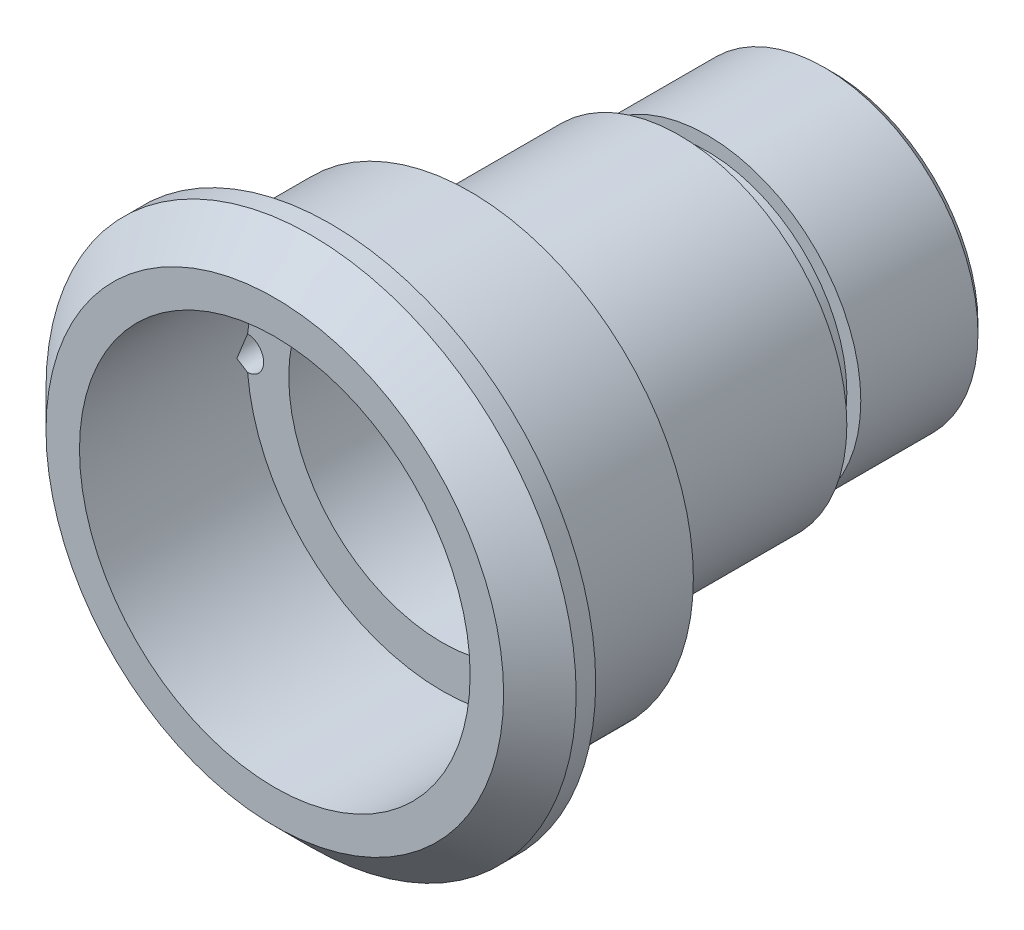
ISO-10303-21;
HEADER;
FILE_DESCRIPTION(('STEP AP214'),'2;1');
FILE_NAME('part.step','',(''),(''),'','','');
FILE_SCHEMA(('AUTOMOTIVE_DESIGN { 1 0 10303 214 1 1 1 1 }'));
ENDSEC;
DATA;
#1=APPLICATION_CONTEXT('core data for automotive mechanical design processes');
#2=APPLICATION_PROTOCOL_DEFINITION('international standard','automotive_design',2000,#1);
#3=PRODUCT_CONTEXT('',#1,'mechanical');
#4=PRODUCT('Part','Part','',(#3));
#5=PRODUCT_RELATED_PRODUCT_CATEGORY('part','',(#4));
#6=PRODUCT_DEFINITION_FORMATION('','',#4);
#7=PRODUCT_DEFINITION_CONTEXT('part definition',#1,'design');
#8=PRODUCT_DEFINITION('design','',#6,#7);
#9=PRODUCT_DEFINITION_SHAPE('','',#8);
#10=(LENGTH_UNIT() NAMED_UNIT(*) SI_UNIT(.MILLI.,.METRE.));
#11=(NAMED_UNIT(*) PLANE_ANGLE_UNIT() SI_UNIT($,.RADIAN.));
#12=(NAMED_UNIT(*) SI_UNIT($,.STERADIAN.) SOLID_ANGLE_UNIT());
#13=UNCERTAINTY_MEASURE_WITH_UNIT(LENGTH_MEASURE(1.E-05),#10,'distance_accuracy_value','');
#14=(GEOMETRIC_REPRESENTATION_CONTEXT(3) GLOBAL_UNCERTAINTY_ASSIGNED_CONTEXT((#13)) GLOBAL_UNIT_ASSIGNED_CONTEXT((#10,
#11,#12)) REPRESENTATION_CONTEXT('',''));
#15=CARTESIAN_POINT('',(0.,0.,0.));
#16=DIRECTION('',(0.,0.,1.));
#17=DIRECTION('',(1.,0.,0.));
#18=AXIS2_PLACEMENT_3D('',#15,#16,#17);
#19=CARTESIAN_POINT('',(0.,0.,-7.));
#20=DIRECTION('',(0.,0.,1.));
#21=DIRECTION('',(1.,0.,0.));
#22=AXIS2_PLACEMENT_3D('',#19,#20,#21);
#23=PLANE('',#22);
#24=CARTESIAN_POINT('',(0.,0.,-7.));
#25=DIRECTION('',(0.,0.,1.));
#26=DIRECTION('',(1.,0.,0.));
#27=AXIS2_PLACEMENT_3D('',#24,#25,#26);
#28=CIRCLE('',#27,8.);
#29=CARTESIAN_POINT('',(8.,0.,-7.));
#30=VERTEX_POINT('',#29);
#31=EDGE_CURVE('E157',#30,#30,#28,.F.);
#32=ORIENTED_EDGE('',*,*,#31,.T.);
#33=EDGE_LOOP('',(#32));
#34=FACE_BOUND('',#33,.T.);
#35=CARTESIAN_POINT('',(7.,0.,-7.));
#36=DIRECTION('',(0.,0.,-1.));
#37=DIRECTION('',(-1.,0.,0.));
#38=AXIS2_PLACEMENT_3D('',#35,#36,#37);
#39=CIRCLE('',#38,0.599999999999989);
#40=CARTESIAN_POINT('',(6.43026088733618,0.188141817523474,-7.));
#41=VERTEX_POINT('',#40);
#42=CARTESIAN_POINT('',(6.43026088733618,-0.188141817523458,-7.));
#43=VERTEX_POINT('',#42);
#44=EDGE_CURVE('E62',#41,#43,#39,.T.);
#45=ORIENTED_EDGE('',*,*,#44,.F.);
#46=CARTESIAN_POINT('',(0.,0.,-7.));
#47=DIRECTION('',(0.,0.,1.));
#48=DIRECTION('',(1.,0.,0.));
#49=AXIS2_PLACEMENT_3D('',#46,#47,#48);
#50=CIRCLE('',#49,6.43301270189221);
#51=CARTESIAN_POINT('',(-6.43026088733618,0.188141817523458,-7.));
#52=VERTEX_POINT('',#51);
#53=EDGE_CURVE('E139',#41,#52,#50,.T.);
#54=ORIENTED_EDGE('',*,*,#53,.T.);
#55=CARTESIAN_POINT('',(-7.,0.,-7.));
#56=DIRECTION('',(0.,0.,-1.));
#57=DIRECTION('',(-1.,0.,0.));
#58=AXIS2_PLACEMENT_3D('',#55,#56,#57);
#59=CIRCLE('',#58,0.599999999999989);
#60=CARTESIAN_POINT('',(-6.43026088733618,-0.188141817523473,-7.));
#61=VERTEX_POINT('',#60);
#62=EDGE_CURVE('E103',#61,#52,#59,.T.);
#63=ORIENTED_EDGE('',*,*,#62,.F.);
#64=EDGE_CURVE('E140',#61,#43,#50,.T.);
#65=ORIENTED_EDGE('',*,*,#64,.T.);
#66=EDGE_LOOP('',(#45,#54,#63,#65));
#67=FACE_BOUND('',#66,.T.);
#68=ADVANCED_FACE('F43',(#34,#67),#23,.F.);
#69=CARTESIAN_POINT('',(0.,0.,-20.));
#70=DIRECTION('',(0.,0.,1.));
#71=DIRECTION('',(1.,0.,0.));
#72=AXIS2_PLACEMENT_3D('',#69,#70,#71);
#73=CYLINDRICAL_SURFACE('',#72,4.05);
#74=CARTESIAN_POINT('',(0.,0.,-14.7));
#75=DIRECTION('',(0.,0.,1.));
#76=DIRECTION('',(1.,0.,0.));
#77=AXIS2_PLACEMENT_3D('',#74,#75,#76);
#78=CIRCLE('',#77,4.05);
#79=CARTESIAN_POINT('',(4.05,0.,-14.7));
#80=VERTEX_POINT('',#79);
#81=EDGE_CURVE('E176',#80,#80,#78,.T.);
#82=ORIENTED_EDGE('',*,*,#81,.T.);
#83=EDGE_LOOP('',(#82));
#84=FACE_BOUND('',#83,.T.);
#85=CARTESIAN_POINT('',(0.,0.,-15.3));
#86=DIRECTION('',(0.,0.,1.));
#87=DIRECTION('',(1.,0.,0.));
#88=AXIS2_PLACEMENT_3D('',#85,#86,#87);
#89=CIRCLE('',#88,4.05);
#90=CARTESIAN_POINT('',(4.05,0.,-15.3));
#91=VERTEX_POINT('',#90);
#92=EDGE_CURVE('E129',#91,#91,#89,.F.);
#93=ORIENTED_EDGE('',*,*,#92,.T.);
#94=EDGE_LOOP('',(#93));
#95=FACE_BOUND('',#94,.T.);
#96=ADVANCED_FACE('F235',(#84,#95),#73,.F.);
#97=CARTESIAN_POINT('',(0.,0.,31.1224482097295));
#98=DIRECTION('',(0.,0.,-1.));
#99=DIRECTION('',(-1.,0.,0.));
#100=AXIS2_PLACEMENT_3D('',#97,#98,#99);
#101=CYLINDRICAL_SURFACE('',#100,6.);
#102=CARTESIAN_POINT('',(0.,0.,-14.5));
#103=DIRECTION('',(0.,0.,1.));
#104=DIRECTION('',(1.,0.,0.));
#105=AXIS2_PLACEMENT_3D('',#102,#103,#104);
#106=CIRCLE('',#105,6.);
#107=CARTESIAN_POINT('',(6.,0.,-14.5));
#108=VERTEX_POINT('',#107);
#109=EDGE_CURVE('E152',#108,#108,#106,.F.);
#110=ORIENTED_EDGE('',*,*,#109,.F.);
#111=EDGE_LOOP('',(#110));
#112=FACE_BOUND('',#111,.T.);
#113=CARTESIAN_POINT('',(0.,0.,-6.75));
#114=DIRECTION('',(0.,0.,1.));
#115=DIRECTION('',(1.,0.,0.));
#116=AXIS2_PLACEMENT_3D('',#113,#114,#115);
#117=CIRCLE('',#116,6.);
#118=CARTESIAN_POINT('',(6.,0.,-6.75));
#119=VERTEX_POINT('',#118);
#120=EDGE_CURVE('E133',#119,#119,#117,.T.);
#121=ORIENTED_EDGE('',*,*,#120,.F.);
#122=EDGE_LOOP('',(#121));
#123=FACE_BOUND('',#122,.T.);
#124=ADVANCED_FACE('F241',(#112,#123),#101,.T.);
#125=CARTESIAN_POINT('',(0.,0.,-14.5));
#126=DIRECTION('',(0.,0.,1.));
#127=DIRECTION('',(1.,0.,0.));
#128=AXIS2_PLACEMENT_3D('',#125,#126,#127);
#129=PLANE('',#128);
#130=ORIENTED_EDGE('',*,*,#109,.T.);
#131=EDGE_LOOP('',(#130));
#132=FACE_BOUND('',#131,.T.);
#133=CARTESIAN_POINT('',(0.,0.,-14.5));
#134=DIRECTION('',(0.,0.,1.));
#135=DIRECTION('',(1.,0.,0.));
#136=AXIS2_PLACEMENT_3D('',#133,#134,#135);
#137=CIRCLE('',#136,5.);
#138=CARTESIAN_POINT('',(5.,0.,-14.5));
#139=VERTEX_POINT('',#138);
#140=EDGE_CURVE('E149',#139,#139,#137,.T.);
#141=ORIENTED_EDGE('',*,*,#140,.T.);
#142=EDGE_LOOP('',(#141));
#143=FACE_BOUND('',#142,.T.);
#144=ADVANCED_FACE('F414',(#132,#143),#129,.F.);
#145=CARTESIAN_POINT('',(0.,0.,0.));
#146=DIRECTION('',(0.,0.,1.));
#147=DIRECTION('',(1.,0.,0.));
#148=AXIS2_PLACEMENT_3D('',#145,#146,#147);
#149=CYLINDRICAL_SURFACE('',#148,5.);
#150=CARTESIAN_POINT('',(0.,0.,-15.5));
#151=DIRECTION('',(0.,0.,1.));
#152=DIRECTION('',(1.,0.,0.));
#153=AXIS2_PLACEMENT_3D('',#150,#151,#152);
#154=CIRCLE('',#153,5.);
#155=CARTESIAN_POINT('',(5.,0.,-15.5));
#156=VERTEX_POINT('',#155);
#157=EDGE_CURVE('E146',#156,#156,#154,.T.);
#158=ORIENTED_EDGE('',*,*,#157,.T.);
#159=EDGE_LOOP('',(#158));
#160=FACE_BOUND('',#159,.T.);
#161=ORIENTED_EDGE('',*,*,#140,.F.);
#162=EDGE_LOOP('',(#161));
#163=FACE_BOUND('',#162,.T.);
#164=ADVANCED_FACE('F406',(#160,#163),#149,.T.);
#165=CARTESIAN_POINT('',(0.,5.5,-15.5));
#166=DIRECTION('',(0.,0.,1.));
#167=DIRECTION('',(1.,0.,0.));
#168=AXIS2_PLACEMENT_3D('',#165,#166,#167);
#169=PLANE('',#168);
#170=CARTESIAN_POINT('',(0.,0.,-15.5));
#171=DIRECTION('',(0.,0.,1.));
#172=DIRECTION('',(1.,0.,0.));
#173=AXIS2_PLACEMENT_3D('',#170,#171,#172);
#174=CIRCLE('',#173,5.5);
#175=CARTESIAN_POINT('',(5.5,0.,-15.5));
#176=VERTEX_POINT('',#175);
#177=EDGE_CURVE('E143',#176,#176,#174,.T.);
#178=ORIENTED_EDGE('',*,*,#177,.T.);
#179=EDGE_LOOP('',(#178));
#180=FACE_BOUND('',#179,.T.);
#181=ORIENTED_EDGE('',*,*,#157,.F.);
#182=EDGE_LOOP('',(#181));
#183=FACE_BOUND('',#182,.T.);
#184=ADVANCED_FACE('F262',(#180,#183),#169,.T.);
#185=CARTESIAN_POINT('',(0.,0.,-20.));
#186=DIRECTION('',(0.,0.,1.));
#187=DIRECTION('',(1.,0.,0.));
#188=AXIS2_PLACEMENT_3D('',#185,#186,#187);
#189=PLANE('',#188);
#190=CARTESIAN_POINT('',(0.,0.,-20.));
#191=DIRECTION('',(0.,0.,-1.));
#192=DIRECTION('',(-1.,0.,0.));
#193=AXIS2_PLACEMENT_3D('',#190,#191,#192);
#194=CIRCLE('',#193,4.5);
#195=CARTESIAN_POINT('',(-4.5,0.,-20.));
#196=VERTEX_POINT('',#195);
#197=EDGE_CURVE('E134',#196,#196,#194,.T.);
#198=ORIENTED_EDGE('',*,*,#197,.F.);
#199=EDGE_LOOP('',(#198));
#200=FACE_BOUND('',#199,.T.);
#201=CARTESIAN_POINT('',(0.,0.,-20.));
#202=DIRECTION('',(0.,0.,1.));
#203=DIRECTION('',(1.,0.,0.));
#204=AXIS2_PLACEMENT_3D('',#201,#202,#203);
#205=CIRCLE('',#204,5.2);
#206=CARTESIAN_POINT('',(5.2,0.,-20.));
#207=VERTEX_POINT('',#206);
#208=EDGE_CURVE('E160',#207,#207,#205,.F.);
#209=ORIENTED_EDGE('',*,*,#208,.T.);
#210=EDGE_LOOP('',(#209));
#211=FACE_BOUND('',#210,.T.);
#212=ADVANCED_FACE('F258',(#200,#211),#189,.F.);
#213=CARTESIAN_POINT('',(0.,0.,21.1360399199047));
#214=DIRECTION('',(0.,0.,-1.));
#215=DIRECTION('',(-1.,0.,0.));
#216=AXIS2_PLACEMENT_3D('',#213,#214,#215);
#217=CYLINDRICAL_SURFACE('',#216,5.5);
#218=CARTESIAN_POINT('',(0.,0.,-19.7));
#219=DIRECTION('',(0.,0.,1.));
#220=DIRECTION('',(1.,0.,0.));
#221=AXIS2_PLACEMENT_3D('',#218,#219,#220);
#222=CIRCLE('',#221,5.5);
#223=CARTESIAN_POINT('',(5.5,0.,-19.7));
#224=VERTEX_POINT('',#223);
#225=EDGE_CURVE('E167',#224,#224,#222,.T.);
#226=ORIENTED_EDGE('',*,*,#225,.T.);
#227=EDGE_LOOP('',(#226));
#228=FACE_BOUND('',#227,.T.);
#229=ORIENTED_EDGE('',*,*,#177,.F.);
#230=EDGE_LOOP('',(#229));
#231=FACE_BOUND('',#230,.T.);
#232=ADVANCED_FACE('F261',(#228,#231),#217,.T.);
#233=CARTESIAN_POINT('',(0.,0.,-20.));
#234=DIRECTION('',(0.,0.,1.));
#235=DIRECTION('',(1.,0.,0.));
#236=AXIS2_PLACEMENT_3D('',#233,#234,#235);
#237=CONICAL_SURFACE('',#236,5.2,0.78539816339744);
#238=ORIENTED_EDGE('',*,*,#225,.F.);
#239=EDGE_LOOP('',(#238));
#240=FACE_BOUND('',#239,.T.);
#241=ORIENTED_EDGE('',*,*,#208,.F.);
#242=EDGE_LOOP('',(#241));
#243=FACE_BOUND('',#242,.T.);
#244=ADVANCED_FACE('F273',(#240,#243),#237,.T.);
#245=CARTESIAN_POINT('',(0.,0.,-6.75));
#246=DIRECTION('',(0.,0.,-1.));
#247=DIRECTION('',(-1.,0.,0.));
#248=AXIS2_PLACEMENT_3D('',#245,#246,#247);
#249=CONICAL_SURFACE('',#248,6.,1.04719755119659);
#250=ORIENTED_EDGE('',*,*,#53,.F.);
#251=CARTESIAN_POINT('',(6.43057924747462,0.189103163890552,-7.0002));
#252=CARTESIAN_POINT('',(6.42158445258452,0.162141832036315,-6.99454693698209));
#253=CARTESIAN_POINT('',(6.41449831943976,0.134278235316516,-6.99008482917071));
#254=CARTESIAN_POINT('',(6.40434421551098,0.0775401713972399,-6.98368444705065));
#255=CARTESIAN_POINT('',(6.40127749449656,0.0486653926514053,-6.98174695773136));
#256=CARTESIAN_POINT('',(6.39936711922312,-0.0093376254860725,-6.98054030471898));
#257=CARTESIAN_POINT('',(6.40053134760479,-0.0384662370095624,-6.98127612163605));
#258=CARTESIAN_POINT('',(6.40702665770008,-0.0960034752482591,-6.98537525876984));
#259=CARTESIAN_POINT('',(6.41234865007396,-0.124413533108999,-6.98873284749048));
#260=CARTESIAN_POINT('',(6.42286989369209,-0.164591652201497,-6.9953542609805));
#261=CARTESIAN_POINT('',(6.42653517301196,-0.176940206941096,-6.99765927538087));
#262=CARTESIAN_POINT('',(6.43057924747462,-0.189103163890554,-7.0002));
#263=B_SPLINE_CURVE_WITH_KNOTS('',3,(#251,#252,#253,#254,#255,#256,#257,#258,#259,#260,#261,
#262),.UNSPECIFIED.,.F.,.F.,(4,2,2,2,2,4),(0.,0.0868643418316701,0.173755686288913,
0.260809000089273,0.347672536276075,0.386888960046872),.UNSPECIFIED.);
#264=EDGE_CURVE('E13',#41,#43,#263,.T.);
#265=ORIENTED_EDGE('',*,*,#264,.T.);
#266=ORIENTED_EDGE('',*,*,#64,.F.);
#267=CARTESIAN_POINT('',(-6.43057924747462,-0.189103163890554,-7.0002));
#268=CARTESIAN_POINT('',(-6.42158445258452,-0.162141832036316,-6.99454693698209));
#269=CARTESIAN_POINT('',(-6.41449831943976,-0.134278235316518,-6.99008482917071));
#270=CARTESIAN_POINT('',(-6.40434421551098,-0.0775401713972414,-6.98368444705065));
#271=CARTESIAN_POINT('',(-6.40127749449656,-0.048665392651407,-6.98174695773136));
#272=CARTESIAN_POINT('',(-6.39936711922312,0.00933762548607073,-6.98054030471898));
#273=CARTESIAN_POINT('',(-6.40053134760479,0.0384662370095606,-6.98127612163605));
#274=CARTESIAN_POINT('',(-6.40702665770008,0.0960034752482573,-6.98537525876984));
#275=CARTESIAN_POINT('',(-6.41234865007396,0.124413533108997,-6.98873284749048));
#276=CARTESIAN_POINT('',(-6.42286989369209,0.164591652201496,-6.9953542609805));
#277=CARTESIAN_POINT('',(-6.42653517301196,0.176940206941095,-6.99765927538087));
#278=CARTESIAN_POINT('',(-6.43057924747462,0.189103163890552,-7.0002));
#279=B_SPLINE_CURVE_WITH_KNOTS('',3,(#267,#268,#269,#270,#271,#272,#273,#274,#275,#276,#277,
#278),.UNSPECIFIED.,.F.,.F.,(4,2,2,2,2,4),(0.,0.0868643418316707,0.173755686288913,
0.260809000089274,0.347672536276076,0.386888960046871),.UNSPECIFIED.);
#280=EDGE_CURVE('E97',#61,#52,#279,.T.);
#281=ORIENTED_EDGE('',*,*,#280,.T.);
#282=EDGE_LOOP('',(#250,#265,#266,#281));
#283=FACE_BOUND('',#282,.T.);
#284=ORIENTED_EDGE('',*,*,#120,.T.);
#285=EDGE_LOOP('',(#284));
#286=FACE_BOUND('',#285,.T.);
#287=ADVANCED_FACE('F268',(#283,#286),#249,.F.);
#288=CARTESIAN_POINT('',(0.,0.,0.));
#289=DIRECTION('',(0.,0.,1.));
#290=DIRECTION('',(1.,0.,0.));
#291=AXIS2_PLACEMENT_3D('',#288,#289,#290);
#292=PLANE('',#291);
#293=CARTESIAN_POINT('',(0.,0.,0.));
#294=DIRECTION('',(0.,0.,1.));
#295=DIRECTION('',(1.,0.,0.));
#296=AXIS2_PLACEMENT_3D('',#293,#294,#295);
#297=CIRCLE('',#296,7.);
#298=CARTESIAN_POINT('',(7.,0.,0.));
#299=VERTEX_POINT('',#298);
#300=EDGE_CURVE('E123',#299,#299,#297,.T.);
#301=ORIENTED_EDGE('',*,*,#300,.F.);
#302=EDGE_LOOP('',(#301));
#303=FACE_BOUND('',#302,.T.);
#304=CARTESIAN_POINT('',(0.,0.,0.));
#305=DIRECTION('',(0.,0.,1.));
#306=DIRECTION('',(1.,0.,0.));
#307=AXIS2_PLACEMENT_3D('',#304,#305,#306);
#308=CIRCLE('',#307,8.20000000000001);
#309=CARTESIAN_POINT('',(8.20000000000001,0.,0.));
#310=VERTEX_POINT('',#309);
#311=EDGE_CURVE('E170',#310,#310,#308,.T.);
#312=ORIENTED_EDGE('',*,*,#311,.T.);
#313=EDGE_LOOP('',(#312));
#314=FACE_BOUND('',#313,.T.);
#315=ADVANCED_FACE('F264',(#303,#314),#292,.T.);
#316=CARTESIAN_POINT('',(0.,0.,0.));
#317=DIRECTION('',(0.,0.,-1.));
#318=DIRECTION('',(-1.,0.,0.));
#319=AXIS2_PLACEMENT_3D('',#316,#317,#318);
#320=CONICAL_SURFACE('',#319,8.20000000000001,0.785398163397446);
#321=CARTESIAN_POINT('',(0.,0.,-1.3));
#322=DIRECTION('',(0.,0.,1.));
#323=DIRECTION('',(1.,0.,0.));
#324=AXIS2_PLACEMENT_3D('',#321,#322,#323);
#325=CIRCLE('',#324,9.5);
#326=CARTESIAN_POINT('',(9.5,0.,-1.3));
#327=VERTEX_POINT('',#326);
#328=EDGE_CURVE('E173',#327,#327,#325,.F.);
#329=ORIENTED_EDGE('',*,*,#328,.F.);
#330=EDGE_LOOP('',(#329));
#331=FACE_BOUND('',#330,.T.);
#332=ORIENTED_EDGE('',*,*,#311,.F.);
#333=EDGE_LOOP('',(#332));
#334=FACE_BOUND('',#333,.T.);
#335=ADVANCED_FACE('F267',(#331,#334),#320,.T.);
#336=CARTESIAN_POINT('',(0.,0.,-20.));
#337=DIRECTION('',(0.,0.,1.));
#338=DIRECTION('',(1.,0.,0.));
#339=AXIS2_PLACEMENT_3D('',#336,#337,#338);
#340=CYLINDRICAL_SURFACE('',#339,9.5);
#341=ORIENTED_EDGE('',*,*,#328,.T.);
#342=EDGE_LOOP('',(#341));
#343=FACE_BOUND('',#342,.T.);
#344=CARTESIAN_POINT('',(0.,0.,-2.));
#345=DIRECTION('',(0.,0.,1.));
#346=DIRECTION('',(1.,0.,0.));
#347=AXIS2_PLACEMENT_3D('',#344,#345,#346);
#348=CIRCLE('',#347,9.5);
#349=CARTESIAN_POINT('',(9.5,0.,-2.));
#350=VERTEX_POINT('',#349);
#351=EDGE_CURVE('E156',#350,#350,#348,.F.);
#352=ORIENTED_EDGE('',*,*,#351,.F.);
#353=EDGE_LOOP('',(#352));
#354=FACE_BOUND('',#353,.T.);
#355=ADVANCED_FACE('F256',(#343,#354),#340,.T.);
#356=CARTESIAN_POINT('',(0.,0.,-2.));
#357=DIRECTION('',(0.,0.,1.));
#358=DIRECTION('',(1.,0.,0.));
#359=AXIS2_PLACEMENT_3D('',#356,#357,#358);
#360=PLANE('',#359);
#361=ORIENTED_EDGE('',*,*,#351,.T.);
#362=EDGE_LOOP('',(#361));
#363=FACE_BOUND('',#362,.T.);
#364=CARTESIAN_POINT('',(0.,0.,-2.));
#365=DIRECTION('',(0.,0.,1.));
#366=DIRECTION('',(1.,0.,0.));
#367=AXIS2_PLACEMENT_3D('',#364,#365,#366);
#368=CIRCLE('',#367,8.);
#369=CARTESIAN_POINT('',(8.,0.,-2.));
#370=VERTEX_POINT('',#369);
#371=EDGE_CURVE('E153',#370,#370,#368,.F.);
#372=ORIENTED_EDGE('',*,*,#371,.F.);
#373=EDGE_LOOP('',(#372));
#374=FACE_BOUND('',#373,.T.);
#375=ADVANCED_FACE('F252',(#363,#374),#360,.F.);
#376=CARTESIAN_POINT('',(0.,0.,33.1224482097295));
#377=DIRECTION('',(0.,0.,-1.));
#378=DIRECTION('',(-1.,0.,0.));
#379=AXIS2_PLACEMENT_3D('',#376,#377,#378);
#380=CYLINDRICAL_SURFACE('',#379,8.);
#381=ORIENTED_EDGE('',*,*,#31,.F.);
#382=EDGE_LOOP('',(#381));
#383=FACE_BOUND('',#382,.T.);
#384=ORIENTED_EDGE('',*,*,#371,.T.);
#385=EDGE_LOOP('',(#384));
#386=FACE_BOUND('',#385,.T.);
#387=ADVANCED_FACE('F248',(#383,#386),#380,.T.);
#388=CARTESIAN_POINT('',(0.,0.,-15.5));
#389=DIRECTION('',(0.,0.,-1.));
#390=DIRECTION('',(-1.,0.,0.));
#391=AXIS2_PLACEMENT_3D('',#388,#389,#390);
#392=PLANE('',#391);
#393=CARTESIAN_POINT('',(0.,0.,-15.5));
#394=DIRECTION('',(0.,0.,-1.));
#395=DIRECTION('',(-1.,0.,0.));
#396=AXIS2_PLACEMENT_3D('',#393,#394,#395);
#397=CIRCLE('',#396,4.45);
#398=CARTESIAN_POINT('',(-4.45,0.,-15.5));
#399=VERTEX_POINT('',#398);
#400=EDGE_CURVE('E118',#399,#399,#397,.T.);
#401=ORIENTED_EDGE('',*,*,#400,.F.);
#402=EDGE_LOOP('',(#401));
#403=FACE_BOUND('',#402,.T.);
#404=CARTESIAN_POINT('',(0.,0.,-15.5));
#405=DIRECTION('',(0.,0.,-1.));
#406=DIRECTION('',(-1.,0.,0.));
#407=AXIS2_PLACEMENT_3D('',#404,#405,#406);
#408=CIRCLE('',#407,4.5);
#409=CARTESIAN_POINT('',(-4.5,0.,-15.5));
#410=VERTEX_POINT('',#409);
#411=EDGE_CURVE('E130',#410,#410,#408,.T.);
#412=ORIENTED_EDGE('',*,*,#411,.T.);
#413=EDGE_LOOP('',(#412));
#414=FACE_BOUND('',#413,.T.);
#415=ADVANCED_FACE('F251',(#403,#414),#392,.T.);
#416=CARTESIAN_POINT('',(0.,0.,-15.5));
#417=DIRECTION('',(0.,0.,-1.));
#418=DIRECTION('',(-1.,0.,0.));
#419=AXIS2_PLACEMENT_3D('',#416,#417,#418);
#420=CYLINDRICAL_SURFACE('',#419,4.5);
#421=ORIENTED_EDGE('',*,*,#411,.F.);
#422=EDGE_LOOP('',(#421));
#423=FACE_BOUND('',#422,.T.);
#424=ORIENTED_EDGE('',*,*,#197,.T.);
#425=EDGE_LOOP('',(#424));
#426=FACE_BOUND('',#425,.T.);
#427=ADVANCED_FACE('F313',(#423,#426),#420,.F.);
#428=CARTESIAN_POINT('',(0.,0.,-15.3));
#429=DIRECTION('',(0.,0.,1.));
#430=DIRECTION('',(1.,0.,0.));
#431=AXIS2_PLACEMENT_3D('',#428,#429,#430);
#432=PLANE('',#431);
#433=CARTESIAN_POINT('',(0.,0.,-15.3));
#434=DIRECTION('',(0.,0.,1.));
#435=DIRECTION('',(1.,0.,0.));
#436=AXIS2_PLACEMENT_3D('',#433,#434,#435);
#437=CIRCLE('',#436,4.45);
#438=CARTESIAN_POINT('',(4.45,0.,-15.3));
#439=VERTEX_POINT('',#438);
#440=EDGE_CURVE('E121',#439,#439,#437,.F.);
#441=ORIENTED_EDGE('',*,*,#440,.T.);
#442=EDGE_LOOP('',(#441));
#443=FACE_BOUND('',#442,.T.);
#444=ORIENTED_EDGE('',*,*,#92,.F.);
#445=EDGE_LOOP('',(#444));
#446=FACE_BOUND('',#445,.T.);
#447=ADVANCED_FACE('F322',(#443,#446),#432,.F.);
#448=CARTESIAN_POINT('',(0.,0.,5.58650070512055));
#449=DIRECTION('',(0.,0.,-1.));
#450=DIRECTION('',(-1.,0.,0.));
#451=AXIS2_PLACEMENT_3D('',#448,#449,#450);
#452=CYLINDRICAL_SURFACE('',#451,4.45);
#453=ORIENTED_EDGE('',*,*,#400,.T.);
#454=EDGE_LOOP('',(#453));
#455=FACE_BOUND('',#454,.T.);
#456=ORIENTED_EDGE('',*,*,#440,.F.);
#457=EDGE_LOOP('',(#456));
#458=FACE_BOUND('',#457,.T.);
#459=ADVANCED_FACE('F202',(#455,#458),#452,.F.);
#460=CARTESIAN_POINT('',(0.,0.,-6.));
#461=DIRECTION('',(0.,0.,1.));
#462=DIRECTION('',(1.,0.,0.));
#463=AXIS2_PLACEMENT_3D('',#460,#461,#462);
#464=PLANE('',#463);
#465=CARTESIAN_POINT('',(7.,0.,-6.));
#466=DIRECTION('',(0.,0.,-1.));
#467=DIRECTION('',(-1.,0.,0.));
#468=AXIS2_PLACEMENT_3D('',#465,#466,#467);
#469=CIRCLE('',#468,0.599999999999989);
#470=CARTESIAN_POINT('',(6.97428571428572,-0.599448726339618,-6.));
#471=VERTEX_POINT('',#470);
#472=CARTESIAN_POINT('',(6.97428571428572,0.599448726339618,-6.));
#473=VERTEX_POINT('',#472);
#474=EDGE_CURVE('E102',#471,#473,#469,.T.);
#475=ORIENTED_EDGE('',*,*,#474,.T.);
#476=CARTESIAN_POINT('',(0.,0.,-6.));
#477=DIRECTION('',(0.,0.,1.));
#478=DIRECTION('',(1.,0.,0.));
#479=AXIS2_PLACEMENT_3D('',#476,#477,#478);
#480=CIRCLE('',#479,7.);
#481=CARTESIAN_POINT('',(-6.97428571428572,0.599448726339618,-6.));
#482=VERTEX_POINT('',#481);
#483=EDGE_CURVE('E111',#482,#473,#480,.F.);
#484=ORIENTED_EDGE('',*,*,#483,.F.);
#485=CARTESIAN_POINT('',(-7.,0.,-6.));
#486=DIRECTION('',(0.,0.,-1.));
#487=DIRECTION('',(-1.,0.,0.));
#488=AXIS2_PLACEMENT_3D('',#485,#486,#487);
#489=CIRCLE('',#488,0.599999999999989);
#490=CARTESIAN_POINT('',(-6.97428571428572,-0.599448726339618,-6.));
#491=VERTEX_POINT('',#490);
#492=EDGE_CURVE('E504',#482,#491,#489,.T.);
#493=ORIENTED_EDGE('',*,*,#492,.T.);
#494=EDGE_CURVE('E112',#471,#491,#480,.F.);
#495=ORIENTED_EDGE('',*,*,#494,.F.);
#496=EDGE_LOOP('',(#475,#484,#493,#495));
#497=FACE_BOUND('',#496,.T.);
#498=CARTESIAN_POINT('',(0.,0.,-6.));
#499=DIRECTION('',(0.,0.,1.));
#500=DIRECTION('',(1.,0.,0.));
#501=AXIS2_PLACEMENT_3D('',#498,#499,#500);
#502=CIRCLE('',#501,5.5);
#503=CARTESIAN_POINT('',(5.5,0.,-6.));
#504=VERTEX_POINT('',#503);
#505=EDGE_CURVE('E514',#504,#504,#502,.T.);
#506=ORIENTED_EDGE('',*,*,#505,.F.);
#507=EDGE_LOOP('',(#506));
#508=FACE_BOUND('',#507,.T.);
#509=ADVANCED_FACE('F108',(#497,#508),#464,.T.);
#510=CARTESIAN_POINT('',(0.,0.,-26.7989898732233));
#511=DIRECTION('',(0.,0.,1.));
#512=DIRECTION('',(1.,0.,0.));
#513=AXIS2_PLACEMENT_3D('',#510,#511,#512);
#514=CYLINDRICAL_SURFACE('',#513,7.);
#515=CARTESIAN_POINT('',(7.,0.,-5.63948362858346));
#516=CARTESIAN_POINT('',(7.,6.25412716117025E-06,-5.63948738644218));
#517=CARTESIAN_POINT('',(6.99999999999162,1.25082543223837E-05,-5.6394911443009));
#518=CARTESIAN_POINT('',(6.9999999998217,7.59068682006893E-05,-5.63952923803128));
#519=CARTESIAN_POINT('',(6.99999999896878,0.000133051354919069,-5.63956357390293));
#520=CARTESIAN_POINT('',(6.99999999120543,0.000418773788601404,-5.63973525326136));
#521=CARTESIAN_POINT('',(6.99999997379878,0.000647351735269703,-5.63987259674821));
#522=CARTESIAN_POINT('',(6.99999983078601,0.00179024147621131,-5.64055931418682));
#523=CARTESIAN_POINT('',(6.99999953724135,0.00270455325702265,-5.64110868812989));
#524=CARTESIAN_POINT('',(6.99999717382547,0.00727611253001088,-5.64385555829682));
#525=CARTESIAN_POINT('',(6.99999241687653,0.0109333588081509,-5.64605305448095));
#526=CARTESIAN_POINT('',(6.99995430173386,0.0292196141896175,-5.65704056323487));
#527=CARTESIAN_POINT('',(6.99987795234534,0.0438485467295221,-5.6658305700553));
#528=CARTESIAN_POINT('',(6.99926686523033,0.116994741604249,-5.70978238793733));
#529=CARTESIAN_POINT('',(6.998044106927,0.175507091602508,-5.74494383698747));
#530=CARTESIAN_POINT('',(6.98825584112023,0.468167491085099,-5.92086569827293));
#531=CARTESIAN_POINT('',(6.96866690398047,0.702000270329759,-6.06160285545552));
#532=CARTESIAN_POINT('',(6.93734346253394,0.934486855358362,-6.20224069143943));
#533=B_SPLINE_CURVE_WITH_KNOTS('',3,(#515,#516,#517,#518,#519,#520,#521,#522,#523,#524,#525,
#526,#527,#528,#529,#530,#531,#532),.UNSPECIFIED.,.F.,.F.,(4,2,2,2,2,2,2,2,4),(0.,
2.18888208499836E-05,0.000221888820860944,0.00102188882156622,0.00422188886669215,
0.017021891754755,0.0682220765934156,0.273033908972941,1.09299396558168),.UNSPECIFIED.);
#534=CARTESIAN_POINT('',(7.,0.,-5.63948362858346));
#535=VERTEX_POINT('',#534);
#536=EDGE_CURVE('E91',#473,#535,#533,.F.);
#537=ORIENTED_EDGE('',*,*,#536,.T.);
#538=CARTESIAN_POINT('',(7.,0.,-5.63948362858346));
#539=CARTESIAN_POINT('',(7.,-6.25412716117025E-06,-5.63948738644218));
#540=CARTESIAN_POINT('',(6.99999999999162,-1.25082543223837E-05,-5.6394911443009));
#541=CARTESIAN_POINT('',(6.9999999998217,-7.59068682006893E-05,-5.63952923803128));
#542=CARTESIAN_POINT('',(6.99999999896878,-0.000133051354919069,-5.63956357390293));
#543=CARTESIAN_POINT('',(6.99999999120543,-0.000418773788601404,-5.63973525326136));
#544=CARTESIAN_POINT('',(6.99999997379878,-0.000647351735269703,-5.63987259674821));
#545=CARTESIAN_POINT('',(6.99999983078601,-0.00179024147621131,-5.64055931418682));
#546=CARTESIAN_POINT('',(6.99999953724135,-0.00270455325702265,-5.64110868812989));
#547=CARTESIAN_POINT('',(6.99999717382547,-0.00727611253001088,-5.64385555829682));
#548=CARTESIAN_POINT('',(6.99999241687653,-0.0109333588081509,-5.64605305448095));
#549=CARTESIAN_POINT('',(6.99995430173386,-0.0292196141896175,-5.65704056323487));
#550=CARTESIAN_POINT('',(6.99987795234534,-0.0438485467295221,-5.6658305700553));
#551=CARTESIAN_POINT('',(6.99926686523033,-0.116994741604249,-5.70978238793733));
#552=CARTESIAN_POINT('',(6.998044106927,-0.175507091602508,-5.74494383698747));
#553=CARTESIAN_POINT('',(6.98825584112023,-0.468167491085099,-5.92086569827293));
#554=CARTESIAN_POINT('',(6.96866690398047,-0.702000270329759,-6.06160285545552));
#555=CARTESIAN_POINT('',(6.93734346253394,-0.934486855358362,-6.20224069143943));
#556=B_SPLINE_CURVE_WITH_KNOTS('',3,(#538,#539,#540,#541,#542,#543,#544,#545,#546,#547,#548,
#549,#550,#551,#552,#553,#554,#555),.UNSPECIFIED.,.F.,.F.,(4,2,2,2,2,2,2,2,4),(0.,
2.18888208499836E-05,0.000221888820860944,0.00102188882156622,0.00422188886669215,
0.017021891754755,0.0682220765934156,0.273033908972941,1.09299396558168),.UNSPECIFIED.);
#557=EDGE_CURVE('E56',#535,#471,#556,.T.);
#558=ORIENTED_EDGE('',*,*,#557,.T.);
#559=ORIENTED_EDGE('',*,*,#494,.T.);
#560=CARTESIAN_POINT('',(-7.,0.,-5.63948362858346));
#561=CARTESIAN_POINT('',(-7.,-6.25412716117025E-06,-5.63948738644218));
#562=CARTESIAN_POINT('',(-6.99999999999162,-1.25082543223837E-05,-5.6394911443009));
#563=CARTESIAN_POINT('',(-6.9999999998217,-7.59068682006893E-05,-5.63952923803128));
#564=CARTESIAN_POINT('',(-6.99999999896878,-0.000133051354919069,-5.63956357390293));
#565=CARTESIAN_POINT('',(-6.99999999120543,-0.000418773788601404,-5.63973525326136));
#566=CARTESIAN_POINT('',(-6.99999997379878,-0.000647351735269703,-5.63987259674821));
#567=CARTESIAN_POINT('',(-6.99999983078601,-0.00179024147621131,-5.64055931418682));
#568=CARTESIAN_POINT('',(-6.99999953724135,-0.00270455325702265,-5.64110868812989));
#569=CARTESIAN_POINT('',(-6.99999717382547,-0.00727611253001088,-5.64385555829682));
#570=CARTESIAN_POINT('',(-6.99999241687653,-0.0109333588081509,-5.64605305448095));
#571=CARTESIAN_POINT('',(-6.99995430173386,-0.0292196141896175,-5.65704056323487));
#572=CARTESIAN_POINT('',(-6.99987795234534,-0.0438485467295221,-5.6658305700553));
#573=CARTESIAN_POINT('',(-6.99926686523033,-0.116994741604249,-5.70978238793733));
#574=CARTESIAN_POINT('',(-6.998044106927,-0.175507091602508,-5.74494383698747));
#575=CARTESIAN_POINT('',(-6.98825584112023,-0.468167491085099,-5.92086569827293));
#576=CARTESIAN_POINT('',(-6.96866690398047,-0.702000270329759,-6.06160285545552));
#577=CARTESIAN_POINT('',(-6.93734346253394,-0.934486855358362,-6.20224069143943));
#578=B_SPLINE_CURVE_WITH_KNOTS('',3,(#560,#561,#562,#563,#564,#565,#566,#567,#568,#569,#570,
#571,#572,#573,#574,#575,#576,#577),.UNSPECIFIED.,.F.,.F.,(4,2,2,2,2,2,2,2,4),(0.,
2.18888208499836E-05,0.000221888820860944,0.00102188882156622,0.00422188886669215,
0.017021891754755,0.0682220765934156,0.273033908972941,1.09299396558168),.UNSPECIFIED.);
#579=CARTESIAN_POINT('',(-7.,0.,-5.63948362858346));
#580=VERTEX_POINT('',#579);
#581=EDGE_CURVE('E181',#491,#580,#578,.F.);
#582=ORIENTED_EDGE('',*,*,#581,.T.);
#583=CARTESIAN_POINT('',(-7.,0.,-5.63948362858346));
#584=CARTESIAN_POINT('',(-7.,6.25412716117025E-06,-5.63948738644218));
#585=CARTESIAN_POINT('',(-6.99999999999162,1.25082543223837E-05,-5.6394911443009));
#586=CARTESIAN_POINT('',(-6.9999999998217,7.59068682006893E-05,-5.63952923803128));
#587=CARTESIAN_POINT('',(-6.99999999896878,0.000133051354919069,-5.63956357390293));
#588=CARTESIAN_POINT('',(-6.99999999120543,0.000418773788601404,-5.63973525326136));
#589=CARTESIAN_POINT('',(-6.99999997379878,0.000647351735269703,-5.63987259674821));
#590=CARTESIAN_POINT('',(-6.99999983078601,0.00179024147621131,-5.64055931418682));
#591=CARTESIAN_POINT('',(-6.99999953724135,0.00270455325702265,-5.64110868812989));
#592=CARTESIAN_POINT('',(-6.99999717382547,0.00727611253001088,-5.64385555829682));
#593=CARTESIAN_POINT('',(-6.99999241687653,0.0109333588081509,-5.64605305448095));
#594=CARTESIAN_POINT('',(-6.99995430173386,0.0292196141896175,-5.65704056323487));
#595=CARTESIAN_POINT('',(-6.99987795234534,0.0438485467295221,-5.6658305700553));
#596=CARTESIAN_POINT('',(-6.99926686523033,0.116994741604249,-5.70978238793733));
#597=CARTESIAN_POINT('',(-6.998044106927,0.175507091602508,-5.74494383698747));
#598=CARTESIAN_POINT('',(-6.98825584112023,0.468167491085099,-5.92086569827293));
#599=CARTESIAN_POINT('',(-6.96866690398047,0.702000270329759,-6.06160285545552));
#600=CARTESIAN_POINT('',(-6.93734346253394,0.934486855358362,-6.20224069143943));
#601=B_SPLINE_CURVE_WITH_KNOTS('',3,(#583,#584,#585,#586,#587,#588,#589,#590,#591,#592,#593,
#594,#595,#596,#597,#598,#599,#600),.UNSPECIFIED.,.F.,.F.,(4,2,2,2,2,2,2,2,4),(0.,
2.18888208499836E-05,0.000221888820860944,0.00102188882156622,0.00422188886669215,
0.017021891754755,0.0682220765934156,0.273033908972941,1.09299396558168),.UNSPECIFIED.);
#602=EDGE_CURVE('E117',#580,#482,#601,.T.);
#603=ORIENTED_EDGE('',*,*,#602,.T.);
#604=ORIENTED_EDGE('',*,*,#483,.T.);
#605=EDGE_LOOP('',(#537,#558,#559,#582,#603,#604));
#606=FACE_BOUND('',#605,.T.);
#607=ORIENTED_EDGE('',*,*,#300,.T.);
#608=EDGE_LOOP('',(#607));
#609=FACE_BOUND('',#608,.T.);
#610=ADVANCED_FACE('F114',(#606,#609),#514,.F.);
#611=CARTESIAN_POINT('',(0.,0.,-11.6));
#612=DIRECTION('',(0.,0.,1.));
#613=DIRECTION('',(1.,0.,0.));
#614=AXIS2_PLACEMENT_3D('',#611,#612,#613);
#615=PLANE('',#614);
#616=CARTESIAN_POINT('',(0.,0.,-11.6));
#617=DIRECTION('',(0.,0.,1.));
#618=DIRECTION('',(1.,0.,0.));
#619=AXIS2_PLACEMENT_3D('',#616,#617,#618);
#620=CIRCLE('',#619,5.25);
#621=CARTESIAN_POINT('',(5.25,0.,-11.6));
#622=VERTEX_POINT('',#621);
#623=EDGE_CURVE('E508',#622,#622,#620,.T.);
#624=ORIENTED_EDGE('',*,*,#623,.F.);
#625=EDGE_LOOP('',(#624));
#626=FACE_BOUND('',#625,.T.);
#627=CARTESIAN_POINT('',(0.,0.,-11.6));
#628=DIRECTION('',(0.,0.,1.));
#629=DIRECTION('',(1.,0.,0.));
#630=AXIS2_PLACEMENT_3D('',#627,#628,#629);
#631=CIRCLE('',#630,5.5);
#632=CARTESIAN_POINT('',(5.5,0.,-11.6));
#633=VERTEX_POINT('',#632);
#634=EDGE_CURVE('E516',#633,#633,#631,.F.);
#635=ORIENTED_EDGE('',*,*,#634,.F.);
#636=EDGE_LOOP('',(#635));
#637=FACE_BOUND('',#636,.T.);
#638=ADVANCED_FACE('F200',(#626,#637),#615,.T.);
#639=CARTESIAN_POINT('',(0.,0.,-31.756349186104));
#640=DIRECTION('',(0.,0.,1.));
#641=DIRECTION('',(1.,0.,0.));
#642=AXIS2_PLACEMENT_3D('',#639,#640,#641);
#643=CYLINDRICAL_SURFACE('',#642,5.5);
#644=CARTESIAN_POINT('',(5.5,0.,-11.6));
#645=CARTESIAN_POINT('',(5.5,0.,-11.5416666666667));
#646=CARTESIAN_POINT('',(5.5,0.,-11.4833333333333));
#647=CARTESIAN_POINT('',(5.5,0.,-11.3666666666667));
#648=CARTESIAN_POINT('',(5.5,0.,-11.3083333333333));
#649=CARTESIAN_POINT('',(5.5,0.,-11.1916666666667));
#650=CARTESIAN_POINT('',(5.5,0.,-11.1333333333333));
#651=CARTESIAN_POINT('',(5.5,0.,-11.0166666666667));
#652=CARTESIAN_POINT('',(5.5,0.,-10.9583333333333));
#653=CARTESIAN_POINT('',(5.5,0.,-10.8416666666667));
#654=CARTESIAN_POINT('',(5.5,0.,-10.7833333333333));
#655=CARTESIAN_POINT('',(5.5,0.,-10.6666666666667));
#656=CARTESIAN_POINT('',(5.5,0.,-10.6083333333333));
#657=CARTESIAN_POINT('',(5.5,0.,-10.4916666666667));
#658=CARTESIAN_POINT('',(5.5,0.,-10.4333333333333));
#659=CARTESIAN_POINT('',(5.5,0.,-10.3166666666667));
#660=CARTESIAN_POINT('',(5.5,0.,-10.2583333333333));
#661=CARTESIAN_POINT('',(5.5,0.,-10.1416666666667));
#662=CARTESIAN_POINT('',(5.5,0.,-10.0833333333333));
#663=CARTESIAN_POINT('',(5.5,0.,-9.96666666666667));
#664=CARTESIAN_POINT('',(5.5,0.,-9.90833333333333));
#665=CARTESIAN_POINT('',(5.5,0.,-9.79166666666667));
#666=CARTESIAN_POINT('',(5.5,0.,-9.73333333333333));
#667=CARTESIAN_POINT('',(5.5,0.,-9.61666666666667));
#668=CARTESIAN_POINT('',(5.5,0.,-9.55833333333334));
#669=CARTESIAN_POINT('',(5.5,0.,-9.44166666666667));
#670=CARTESIAN_POINT('',(5.5,0.,-9.38333333333334));
#671=CARTESIAN_POINT('',(5.5,0.,-9.26666666666667));
#672=CARTESIAN_POINT('',(5.5,0.,-9.20833333333334));
#673=CARTESIAN_POINT('',(5.5,0.,-9.09166666666667));
#674=CARTESIAN_POINT('',(5.5,0.,-9.03333333333333));
#675=CARTESIAN_POINT('',(5.5,0.,-8.91666666666667));
#676=CARTESIAN_POINT('',(5.5,0.,-8.85833333333333));
#677=CARTESIAN_POINT('',(5.5,0.,-8.74166666666667));
#678=CARTESIAN_POINT('',(5.5,0.,-8.68333333333334));
#679=CARTESIAN_POINT('',(5.5,0.,-8.56666666666667));
#680=CARTESIAN_POINT('',(5.5,0.,-8.50833333333334));
#681=CARTESIAN_POINT('',(5.5,0.,-8.39166666666667));
#682=CARTESIAN_POINT('',(5.5,0.,-8.33333333333334));
#683=CARTESIAN_POINT('',(5.5,0.,-8.21666666666667));
#684=CARTESIAN_POINT('',(5.5,0.,-8.15833333333333));
#685=CARTESIAN_POINT('',(5.5,0.,-8.04166666666667));
#686=CARTESIAN_POINT('',(5.5,0.,-7.98333333333334));
#687=CARTESIAN_POINT('',(5.5,0.,-7.86666666666667));
#688=CARTESIAN_POINT('',(5.5,0.,-7.80833333333334));
#689=CARTESIAN_POINT('',(5.5,0.,-7.69166666666667));
#690=CARTESIAN_POINT('',(5.5,0.,-7.63333333333334));
#691=CARTESIAN_POINT('',(5.5,0.,-7.51666666666667));
#692=CARTESIAN_POINT('',(5.5,0.,-7.45833333333333));
#693=CARTESIAN_POINT('',(5.5,0.,-7.34166666666667));
#694=CARTESIAN_POINT('',(5.5,0.,-7.28333333333333));
#695=CARTESIAN_POINT('',(5.5,0.,-7.16666666666667));
#696=CARTESIAN_POINT('',(5.5,0.,-7.10833333333334));
#697=CARTESIAN_POINT('',(5.5,0.,-6.99166666666667));
#698=CARTESIAN_POINT('',(5.5,0.,-6.93333333333334));
#699=CARTESIAN_POINT('',(5.5,0.,-6.81666666666667));
#700=CARTESIAN_POINT('',(5.5,0.,-6.75833333333333));
#701=CARTESIAN_POINT('',(5.5,0.,-6.64166666666667));
#702=CARTESIAN_POINT('',(5.5,0.,-6.58333333333334));
#703=CARTESIAN_POINT('',(5.5,0.,-6.46666666666667));
#704=CARTESIAN_POINT('',(5.5,0.,-6.40833333333333));
#705=CARTESIAN_POINT('',(5.5,0.,-6.29166666666667));
#706=CARTESIAN_POINT('',(5.5,0.,-6.23333333333334));
#707=CARTESIAN_POINT('',(5.5,0.,-6.11666666666667));
#708=CARTESIAN_POINT('',(5.5,0.,-6.05833333333334));
#709=CARTESIAN_POINT('',(5.5,0.,-6.));
#710=B_SPLINE_CURVE_WITH_KNOTS('',3,(#644,#645,#646,#647,#648,#649,#650,#651,#652,#653,#654,
#655,#656,#657,#658,#659,#660,#661,#662,#663,#664,#665,#666,#667,#668,#669,#670,#671,#672,#673,
#674,#675,#676,#677,#678,#679,#680,#681,#682,#683,#684,#685,#686,#687,#688,#689,#690,#691,#692,
#693,#694,#695,#696,#697,#698,#699,#700,#701,#702,#703,#704,#705,#706,#707,#708,#709),
.UNSPECIFIED.,.F.,.F.,(4,2,2,2,2,2,2,2,2,2,2,2,2,2,2,2,2,2,2,2,2,2,2,2,2,2,2,2,2,2,2,2,4),(0.,
0.175000000000002,0.35,0.525000000000001,0.699999999999999,0.875000000000001,1.05,1.225,1.4,
1.575,1.75,1.925,2.1,2.275,2.45,2.625,2.8,2.975,3.15,3.325,3.5,3.675,3.85,4.025,4.2,4.375,4.55,
4.725,4.9,5.075,5.25,5.425,5.6),.UNSPECIFIED.);
#711=EDGE_CURVE('BSEAM352',#633,#504,#710,.T.);
#712=ORIENTED_EDGE('',*,*,#634,.T.);
#713=ORIENTED_EDGE('',*,*,#505,.T.);
#714=ORIENTED_EDGE('',*,*,#711,.T.);
#715=ORIENTED_EDGE('',*,*,#711,.F.);
#716=EDGE_LOOP('',(#712,#714,#713,#715));
#717=FACE_BOUND('',#716,.T.);
#718=ADVANCED_FACE('F352',(#717),#643,.F.);
#719=CARTESIAN_POINT('',(0.,0.,-34.8492424049175));
#720=DIRECTION('',(0.,0.,1.));
#721=DIRECTION('',(1.,0.,0.));
#722=AXIS2_PLACEMENT_3D('',#719,#720,#721);
#723=CYLINDRICAL_SURFACE('',#722,5.25);
#724=CARTESIAN_POINT('',(0.,0.,-13.5));
#725=DIRECTION('',(0.,0.,1.));
#726=DIRECTION('',(1.,0.,0.));
#727=AXIS2_PLACEMENT_3D('',#724,#725,#726);
#728=CIRCLE('',#727,5.25);
#729=CARTESIAN_POINT('',(5.25,0.,-13.5));
#730=VERTEX_POINT('',#729);
#731=EDGE_CURVE('E511',#730,#730,#728,.F.);
#732=ORIENTED_EDGE('',*,*,#731,.T.);
#733=EDGE_LOOP('',(#732));
#734=FACE_BOUND('',#733,.T.);
#735=ORIENTED_EDGE('',*,*,#623,.T.);
#736=EDGE_LOOP('',(#735));
#737=FACE_BOUND('',#736,.T.);
#738=ADVANCED_FACE('F230',(#734,#737),#723,.F.);
#739=CARTESIAN_POINT('',(0.,0.,-13.5));
#740=DIRECTION('',(0.,0.,1.));
#741=DIRECTION('',(1.,0.,0.));
#742=AXIS2_PLACEMENT_3D('',#739,#740,#741);
#743=CONICAL_SURFACE('',#742,5.25000000000001,0.785398163397448);
#744=ORIENTED_EDGE('',*,*,#81,.F.);
#745=EDGE_LOOP('',(#744));
#746=FACE_BOUND('',#745,.T.);
#747=ORIENTED_EDGE('',*,*,#731,.F.);
#748=EDGE_LOOP('',(#747));
#749=FACE_BOUND('',#748,.T.);
#750=ADVANCED_FACE('F45',(#746,#749),#743,.F.);
#751=CARTESIAN_POINT('',(-7.,0.,-7.));
#752=DIRECTION('',(0.,0.,-1.));
#753=DIRECTION('',(-1.,0.,0.));
#754=AXIS2_PLACEMENT_3D('',#751,#752,#753);
#755=CYLINDRICAL_SURFACE('',#754,0.599999999999989);
#756=ORIENTED_EDGE('',*,*,#492,.F.);
#757=EDGE_CURVE('E502',#491,#482,#489,.T.);
#758=ORIENTED_EDGE('',*,*,#757,.F.);
#759=EDGE_LOOP('',(#756,#758));
#760=FACE_BOUND('',#759,.T.);
#761=ORIENTED_EDGE('',*,*,#62,.T.);
#762=ORIENTED_EDGE('',*,*,#280,.F.);
#763=EDGE_LOOP('',(#761,#762));
#764=FACE_BOUND('',#763,.T.);
#765=ADVANCED_FACE('F220',(#760,#764),#755,.F.);
#766=CARTESIAN_POINT('',(-7.,0.,-6.));
#767=DIRECTION('',(0.,0.,-1.));
#768=DIRECTION('',(-1.,0.,0.));
#769=AXIS2_PLACEMENT_3D('',#766,#767,#768);
#770=CONICAL_SURFACE('',#769,0.599999999999989,1.02974425867665);
#771=ORIENTED_EDGE('',*,*,#581,.F.);
#772=ORIENTED_EDGE('',*,*,#757,.T.);
#773=ORIENTED_EDGE('',*,*,#602,.F.);
#774=EDGE_LOOP('',(#771,#772,#773));
#775=FACE_BOUND('',#774,.T.);
#776=ADVANCED_FACE('F192',(#775),#770,.F.);
#777=CARTESIAN_POINT('',(7.,0.,-7.));
#778=DIRECTION('',(0.,0.,-1.));
#779=DIRECTION('',(-1.,0.,0.));
#780=AXIS2_PLACEMENT_3D('',#777,#778,#779);
#781=CYLINDRICAL_SURFACE('',#780,0.599999999999989);
#782=EDGE_CURVE('E94',#473,#471,#469,.T.);
#783=ORIENTED_EDGE('',*,*,#782,.F.);
#784=ORIENTED_EDGE('',*,*,#474,.F.);
#785=EDGE_LOOP('',(#783,#784));
#786=FACE_BOUND('',#785,.T.);
#787=ORIENTED_EDGE('',*,*,#44,.T.);
#788=ORIENTED_EDGE('',*,*,#264,.F.);
#789=EDGE_LOOP('',(#787,#788));
#790=FACE_BOUND('',#789,.T.);
#791=ADVANCED_FACE('F101',(#786,#790),#781,.F.);
#792=CARTESIAN_POINT('',(7.,0.,-6.));
#793=DIRECTION('',(0.,0.,-1.));
#794=DIRECTION('',(-1.,0.,0.));
#795=AXIS2_PLACEMENT_3D('',#792,#793,#794);
#796=CONICAL_SURFACE('',#795,0.599999999999989,1.02974425867665);
#797=ORIENTED_EDGE('',*,*,#536,.F.);
#798=ORIENTED_EDGE('',*,*,#782,.T.);
#799=ORIENTED_EDGE('',*,*,#557,.F.);
#800=EDGE_LOOP('',(#797,#798,#799));
#801=FACE_BOUND('',#800,.T.);
#802=ADVANCED_FACE('F93',(#801),#796,.F.);
#803=CLOSED_SHELL('',(#68,#96,#124,#144,#164,#184,#212,#232,#244,#287,#315,#335,#355,#375,#387,
#415,#427,#447,#459,#509,#610,#638,#718,#738,#750,#765,#776,#791,#802));
#804=MANIFOLD_SOLID_BREP('B2',#803);
#805=ADVANCED_BREP_SHAPE_REPRESENTATION('',(#18,#804),#14);
#806=SHAPE_DEFINITION_REPRESENTATION(#9,#805);
ENDSEC;
END-ISO-10303-21;
